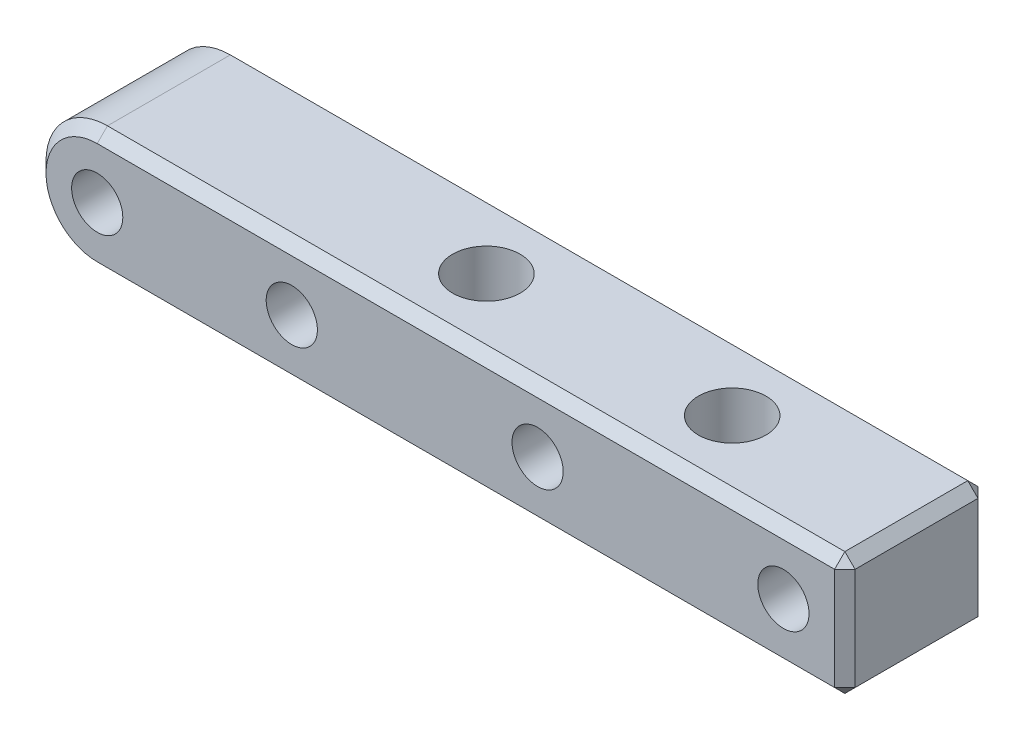
ISO-10303-21;
HEADER;
FILE_DESCRIPTION(('STEP AP214'),'2;1');
FILE_NAME('part.step','',(''),(''),'','','');
FILE_SCHEMA(('AUTOMOTIVE_DESIGN { 1 0 10303 214 1 1 1 1 }'));
ENDSEC;
DATA;
#1=APPLICATION_CONTEXT('core data for automotive mechanical design processes');
#2=APPLICATION_PROTOCOL_DEFINITION('international standard','automotive_design',2000,#1);
#3=PRODUCT_CONTEXT('',#1,'mechanical');
#4=PRODUCT('Part','Part','',(#3));
#5=PRODUCT_RELATED_PRODUCT_CATEGORY('part','',(#4));
#6=PRODUCT_DEFINITION_FORMATION('','',#4);
#7=PRODUCT_DEFINITION_CONTEXT('part definition',#1,'design');
#8=PRODUCT_DEFINITION('design','',#6,#7);
#9=PRODUCT_DEFINITION_SHAPE('','',#8);
#10=(LENGTH_UNIT() NAMED_UNIT(*) SI_UNIT(.MILLI.,.METRE.));
#11=(NAMED_UNIT(*) PLANE_ANGLE_UNIT() SI_UNIT($,.RADIAN.));
#12=(NAMED_UNIT(*) SI_UNIT($,.STERADIAN.) SOLID_ANGLE_UNIT());
#13=UNCERTAINTY_MEASURE_WITH_UNIT(LENGTH_MEASURE(1.E-05),#10,'distance_accuracy_value','');
#14=(GEOMETRIC_REPRESENTATION_CONTEXT(3) GLOBAL_UNCERTAINTY_ASSIGNED_CONTEXT((#13)) GLOBAL_UNIT_ASSIGNED_CONTEXT((#10,
#11,#12)) REPRESENTATION_CONTEXT('',''));
#15=CARTESIAN_POINT('',(0.,0.,0.));
#16=DIRECTION('',(0.,0.,1.));
#17=DIRECTION('',(1.,0.,0.));
#18=AXIS2_PLACEMENT_3D('',#15,#16,#17);
#19=CARTESIAN_POINT('',(-33.5,0.,3.5));
#20=DIRECTION('',(0.,0.,1.));
#21=DIRECTION('',(1.,0.,0.));
#22=AXIS2_PLACEMENT_3D('',#19,#20,#21);
#23=PLANE('',#22);
#24=CARTESIAN_POINT('',(-33.5,0.,3.5));
#25=DIRECTION('',(0.,0.,1.));
#26=DIRECTION('',(1.,0.,0.));
#27=AXIS2_PLACEMENT_3D('',#24,#25,#26);
#28=CIRCLE('',#27,2.5);
#29=CARTESIAN_POINT('',(-33.5,2.49999999999999,3.5));
#30=VERTEX_POINT('',#29);
#31=CARTESIAN_POINT('',(-33.5,-2.5,3.5));
#32=VERTEX_POINT('',#31);
#33=EDGE_CURVE('E210',#30,#32,#28,.T.);
#34=ORIENTED_EDGE('',*,*,#33,.T.);
#35=DIRECTION('',(1.,0.,0.));
#36=VECTOR('',#35,1.);
#37=CARTESIAN_POINT('',(3.,-2.5,3.5));
#38=LINE('',#37,#36);
#39=CARTESIAN_POINT('',(2.5,-2.5,3.5));
#40=VERTEX_POINT('',#39);
#41=EDGE_CURVE('E155',#32,#40,#38,.T.);
#42=ORIENTED_EDGE('',*,*,#41,.T.);
#43=DIRECTION('',(0.,1.,0.));
#44=VECTOR('',#43,1.);
#45=CARTESIAN_POINT('',(2.49999999999999,3.,3.5));
#46=LINE('',#45,#44);
#47=CARTESIAN_POINT('',(2.49999999999999,2.49999999999999,3.5));
#48=VERTEX_POINT('',#47);
#49=EDGE_CURVE('E212',#40,#48,#46,.T.);
#50=ORIENTED_EDGE('',*,*,#49,.T.);
#51=DIRECTION('',(-1.,0.,0.));
#52=VECTOR('',#51,1.);
#53=CARTESIAN_POINT('',(-33.5,2.49999999999999,3.5));
#54=LINE('',#53,#52);
#55=EDGE_CURVE('E214',#48,#30,#54,.T.);
#56=ORIENTED_EDGE('',*,*,#55,.T.);
#57=EDGE_LOOP('',(#34,#42,#50,#56));
#58=FACE_BOUND('',#57,.T.);
#59=CARTESIAN_POINT('',(0.,0.,3.5));
#60=DIRECTION('',(0.,0.,1.));
#61=DIRECTION('',(1.,0.,0.));
#62=AXIS2_PLACEMENT_3D('',#59,#60,#61);
#63=CIRCLE('',#62,1.25);
#64=CARTESIAN_POINT('',(1.25,0.,3.5));
#65=VERTEX_POINT('',#64);
#66=EDGE_CURVE('E248',#65,#65,#63,.T.);
#67=ORIENTED_EDGE('',*,*,#66,.F.);
#68=EDGE_LOOP('',(#67));
#69=FACE_BOUND('',#68,.T.);
#70=CARTESIAN_POINT('',(-12.,0.,3.5));
#71=DIRECTION('',(0.,0.,1.));
#72=DIRECTION('',(1.,0.,0.));
#73=AXIS2_PLACEMENT_3D('',#70,#71,#72);
#74=CIRCLE('',#73,1.25);
#75=CARTESIAN_POINT('',(-10.75,0.,3.5));
#76=VERTEX_POINT('',#75);
#77=EDGE_CURVE('E242',#76,#76,#74,.T.);
#78=ORIENTED_EDGE('',*,*,#77,.F.);
#79=EDGE_LOOP('',(#78));
#80=FACE_BOUND('',#79,.T.);
#81=CARTESIAN_POINT('',(-24.,0.,3.5));
#82=DIRECTION('',(0.,0.,1.));
#83=DIRECTION('',(1.,0.,0.));
#84=AXIS2_PLACEMENT_3D('',#81,#82,#83);
#85=CIRCLE('',#84,1.25);
#86=CARTESIAN_POINT('',(-22.75,0.,3.5));
#87=VERTEX_POINT('',#86);
#88=EDGE_CURVE('E236',#87,#87,#85,.T.);
#89=ORIENTED_EDGE('',*,*,#88,.F.);
#90=EDGE_LOOP('',(#89));
#91=FACE_BOUND('',#90,.T.);
#92=CARTESIAN_POINT('',(-33.5,0.,3.5));
#93=DIRECTION('',(0.,0.,1.));
#94=DIRECTION('',(1.,0.,0.));
#95=AXIS2_PLACEMENT_3D('',#92,#93,#94);
#96=CIRCLE('',#95,1.25);
#97=CARTESIAN_POINT('',(-32.25,0.,3.5));
#98=VERTEX_POINT('',#97);
#99=EDGE_CURVE('E230',#98,#98,#96,.T.);
#100=ORIENTED_EDGE('',*,*,#99,.F.);
#101=EDGE_LOOP('',(#100));
#102=FACE_BOUND('',#101,.T.);
#103=ADVANCED_FACE('F45',(#58,#69,#80,#91,#102),#23,.T.);
#104=CARTESIAN_POINT('',(-33.5,0.,-3.5));
#105=DIRECTION('',(0.,0.,1.));
#106=DIRECTION('',(1.,0.,0.));
#107=AXIS2_PLACEMENT_3D('',#104,#105,#106);
#108=PLANE('',#107);
#109=DIRECTION('',(0.,-1.,0.));
#110=VECTOR('',#109,1.);
#111=CARTESIAN_POINT('',(2.5,0.,-3.5));
#112=LINE('',#111,#110);
#113=CARTESIAN_POINT('',(2.49999999999999,2.49999999999999,-3.5));
#114=VERTEX_POINT('',#113);
#115=CARTESIAN_POINT('',(2.5,-2.5,-3.5));
#116=VERTEX_POINT('',#115);
#117=EDGE_CURVE('E221',#114,#116,#112,.T.);
#118=ORIENTED_EDGE('',*,*,#117,.T.);
#119=DIRECTION('',(-1.,0.,0.));
#120=VECTOR('',#119,1.);
#121=CARTESIAN_POINT('',(-33.5,-2.5,-3.5));
#122=LINE('',#121,#120);
#123=CARTESIAN_POINT('',(-33.5,-2.5,-3.5));
#124=VERTEX_POINT('',#123);
#125=EDGE_CURVE('E216',#116,#124,#122,.T.);
#126=ORIENTED_EDGE('',*,*,#125,.T.);
#127=CARTESIAN_POINT('',(-33.5,0.,-3.5));
#128=DIRECTION('',(0.,0.,1.));
#129=DIRECTION('',(1.,0.,0.));
#130=AXIS2_PLACEMENT_3D('',#127,#128,#129);
#131=CIRCLE('',#130,2.5);
#132=CARTESIAN_POINT('',(-33.5,2.49999999999999,-3.5));
#133=VERTEX_POINT('',#132);
#134=EDGE_CURVE('E219',#124,#133,#131,.F.);
#135=ORIENTED_EDGE('',*,*,#134,.T.);
#136=DIRECTION('',(1.,0.,0.));
#137=VECTOR('',#136,1.);
#138=CARTESIAN_POINT('',(-33.5,2.49999999999999,-3.5));
#139=LINE('',#138,#137);
#140=EDGE_CURVE('E223',#133,#114,#139,.T.);
#141=ORIENTED_EDGE('',*,*,#140,.T.);
#142=EDGE_LOOP('',(#118,#126,#135,#141));
#143=FACE_BOUND('',#142,.T.);
#144=CARTESIAN_POINT('',(0.,0.,-3.5));
#145=DIRECTION('',(0.,0.,1.));
#146=DIRECTION('',(1.,0.,0.));
#147=AXIS2_PLACEMENT_3D('',#144,#145,#146);
#148=CIRCLE('',#147,1.25);
#149=CARTESIAN_POINT('',(1.25,0.,-3.5));
#150=VERTEX_POINT('',#149);
#151=EDGE_CURVE('E245',#150,#150,#148,.T.);
#152=ORIENTED_EDGE('',*,*,#151,.T.);
#153=EDGE_LOOP('',(#152));
#154=FACE_BOUND('',#153,.T.);
#155=CARTESIAN_POINT('',(-12.,0.,-3.5));
#156=DIRECTION('',(0.,0.,1.));
#157=DIRECTION('',(1.,0.,0.));
#158=AXIS2_PLACEMENT_3D('',#155,#156,#157);
#159=CIRCLE('',#158,1.25);
#160=CARTESIAN_POINT('',(-10.75,0.,-3.5));
#161=VERTEX_POINT('',#160);
#162=EDGE_CURVE('E239',#161,#161,#159,.T.);
#163=ORIENTED_EDGE('',*,*,#162,.T.);
#164=EDGE_LOOP('',(#163));
#165=FACE_BOUND('',#164,.T.);
#166=CARTESIAN_POINT('',(-24.,0.,-3.5));
#167=DIRECTION('',(0.,0.,1.));
#168=DIRECTION('',(1.,0.,0.));
#169=AXIS2_PLACEMENT_3D('',#166,#167,#168);
#170=CIRCLE('',#169,1.25);
#171=CARTESIAN_POINT('',(-22.75,0.,-3.5));
#172=VERTEX_POINT('',#171);
#173=EDGE_CURVE('E233',#172,#172,#170,.T.);
#174=ORIENTED_EDGE('',*,*,#173,.T.);
#175=EDGE_LOOP('',(#174));
#176=FACE_BOUND('',#175,.T.);
#177=CARTESIAN_POINT('',(-33.5,0.,-3.5));
#178=DIRECTION('',(0.,0.,1.));
#179=DIRECTION('',(1.,0.,0.));
#180=AXIS2_PLACEMENT_3D('',#177,#178,#179);
#181=CIRCLE('',#180,1.25);
#182=CARTESIAN_POINT('',(-32.25,0.,-3.5));
#183=VERTEX_POINT('',#182);
#184=EDGE_CURVE('E145',#183,#183,#181,.T.);
#185=ORIENTED_EDGE('',*,*,#184,.T.);
#186=EDGE_LOOP('',(#185));
#187=FACE_BOUND('',#186,.T.);
#188=ADVANCED_FACE('F269',(#143,#154,#165,#176,#187),#108,.F.);
#189=CARTESIAN_POINT('',(-33.5,3.,3.5));
#190=DIRECTION('',(0.,-1.,0.));
#191=DIRECTION('',(1.,0.,0.));
#192=AXIS2_PLACEMENT_3D('',#189,#190,#191);
#193=PLANE('',#192);
#194=CARTESIAN_POINT('',(-6.,3.,0.));
#195=DIRECTION('',(0.,1.,0.));
#196=DIRECTION('',(0.,0.,1.));
#197=AXIS2_PLACEMENT_3D('',#194,#195,#196);
#198=CIRCLE('',#197,1.65);
#199=CARTESIAN_POINT('',(-6.,3.,1.65));
#200=VERTEX_POINT('',#199);
#201=EDGE_CURVE('E260',#200,#200,#198,.T.);
#202=ORIENTED_EDGE('',*,*,#201,.F.);
#203=EDGE_LOOP('',(#202));
#204=FACE_BOUND('',#203,.T.);
#205=CARTESIAN_POINT('',(-18.,3.,0.));
#206=DIRECTION('',(0.,1.,0.));
#207=DIRECTION('',(0.,0.,1.));
#208=AXIS2_PLACEMENT_3D('',#205,#206,#207);
#209=CIRCLE('',#208,1.65);
#210=CARTESIAN_POINT('',(-18.,3.,1.65));
#211=VERTEX_POINT('',#210);
#212=EDGE_CURVE('E254',#211,#211,#209,.T.);
#213=ORIENTED_EDGE('',*,*,#212,.F.);
#214=EDGE_LOOP('',(#213));
#215=FACE_BOUND('',#214,.T.);
#216=DIRECTION('',(0.,0.,-1.));
#217=VECTOR('',#216,1.);
#218=CARTESIAN_POINT('',(2.5,3.,3.5));
#219=LINE('',#218,#217);
#220=CARTESIAN_POINT('',(2.5,3.,3.));
#221=VERTEX_POINT('',#220);
#222=CARTESIAN_POINT('',(2.5,3.,-3.));
#223=VERTEX_POINT('',#222);
#224=EDGE_CURVE('E54',#221,#223,#219,.T.);
#225=ORIENTED_EDGE('',*,*,#224,.T.);
#226=DIRECTION('',(-1.,0.,0.));
#227=VECTOR('',#226,1.);
#228=CARTESIAN_POINT('',(-33.5,3.,-3.));
#229=LINE('',#228,#227);
#230=CARTESIAN_POINT('',(-33.5,3.,-3.));
#231=VERTEX_POINT('',#230);
#232=EDGE_CURVE('E11',#223,#231,#229,.T.);
#233=ORIENTED_EDGE('',*,*,#232,.T.);
#234=DIRECTION('',(0.,0.,-1.));
#235=VECTOR('',#234,1.);
#236=CARTESIAN_POINT('',(-33.5,3.,3.5));
#237=LINE('',#236,#235);
#238=CARTESIAN_POINT('',(-33.5,3.,3.));
#239=VERTEX_POINT('',#238);
#240=EDGE_CURVE('E144',#239,#231,#237,.T.);
#241=ORIENTED_EDGE('',*,*,#240,.F.);
#242=DIRECTION('',(1.,0.,0.));
#243=VECTOR('',#242,1.);
#244=CARTESIAN_POINT('',(3.,3.,3.));
#245=LINE('',#244,#243);
#246=EDGE_CURVE('E65',#239,#221,#245,.T.);
#247=ORIENTED_EDGE('',*,*,#246,.T.);
#248=EDGE_LOOP('',(#225,#233,#241,#247));
#249=FACE_BOUND('',#248,.T.);
#250=ADVANCED_FACE('F266',(#204,#215,#249),#193,.F.);
#251=CARTESIAN_POINT('',(-33.5,0.,3.5));
#252=DIRECTION('',(0.,0.,-1.));
#253=DIRECTION('',(-1.,0.,0.));
#254=AXIS2_PLACEMENT_3D('',#251,#252,#253);
#255=CYLINDRICAL_SURFACE('',#254,3.);
#256=ORIENTED_EDGE('',*,*,#240,.T.);
#257=CARTESIAN_POINT('',(-33.5,0.,-3.));
#258=DIRECTION('',(0.,0.,1.));
#259=DIRECTION('',(1.,0.,0.));
#260=AXIS2_PLACEMENT_3D('',#257,#258,#259);
#261=CIRCLE('',#260,3.);
#262=CARTESIAN_POINT('',(-33.5,-3.,-3.));
#263=VERTEX_POINT('',#262);
#264=EDGE_CURVE('E143',#231,#263,#261,.T.);
#265=ORIENTED_EDGE('',*,*,#264,.T.);
#266=DIRECTION('',(0.,0.,-1.));
#267=VECTOR('',#266,1.);
#268=CARTESIAN_POINT('',(-33.5,-3.,3.5));
#269=LINE('',#268,#267);
#270=CARTESIAN_POINT('',(-33.5,-3.,3.));
#271=VERTEX_POINT('',#270);
#272=EDGE_CURVE('E127',#271,#263,#269,.T.);
#273=ORIENTED_EDGE('',*,*,#272,.F.);
#274=CARTESIAN_POINT('',(-33.5,0.,3.));
#275=DIRECTION('',(0.,0.,1.));
#276=DIRECTION('',(1.,0.,0.));
#277=AXIS2_PLACEMENT_3D('',#274,#275,#276);
#278=CIRCLE('',#277,3.);
#279=EDGE_CURVE('E141',#271,#239,#278,.F.);
#280=ORIENTED_EDGE('',*,*,#279,.T.);
#281=EDGE_LOOP('',(#256,#265,#273,#280));
#282=FACE_BOUND('',#281,.T.);
#283=ADVANCED_FACE('F140',(#282),#255,.T.);
#284=CARTESIAN_POINT('',(3.,-3.,3.5));
#285=DIRECTION('',(0.,1.,0.));
#286=DIRECTION('',(-1.,0.,0.));
#287=AXIS2_PLACEMENT_3D('',#284,#285,#286);
#288=PLANE('',#287);
#289=ORIENTED_EDGE('',*,*,#272,.T.);
#290=DIRECTION('',(1.,0.,0.));
#291=VECTOR('',#290,1.);
#292=CARTESIAN_POINT('',(3.,-3.,-3.));
#293=LINE('',#292,#291);
#294=CARTESIAN_POINT('',(2.5,-3.,-3.));
#295=VERTEX_POINT('',#294);
#296=EDGE_CURVE('E135',#263,#295,#293,.T.);
#297=ORIENTED_EDGE('',*,*,#296,.T.);
#298=DIRECTION('',(0.,0.,1.));
#299=VECTOR('',#298,1.);
#300=CARTESIAN_POINT('',(2.5,-3.,3.5));
#301=LINE('',#300,#299);
#302=CARTESIAN_POINT('',(2.5,-3.,3.));
#303=VERTEX_POINT('',#302);
#304=EDGE_CURVE('E130',#295,#303,#301,.T.);
#305=ORIENTED_EDGE('',*,*,#304,.T.);
#306=DIRECTION('',(-1.,0.,0.));
#307=VECTOR('',#306,1.);
#308=CARTESIAN_POINT('',(-33.5,-3.,3.));
#309=LINE('',#308,#307);
#310=EDGE_CURVE('E122',#303,#271,#309,.T.);
#311=ORIENTED_EDGE('',*,*,#310,.T.);
#312=EDGE_LOOP('',(#289,#297,#305,#311));
#313=FACE_BOUND('',#312,.T.);
#314=CARTESIAN_POINT('',(-6.,-3.,0.));
#315=DIRECTION('',(0.,1.,0.));
#316=DIRECTION('',(0.,0.,1.));
#317=AXIS2_PLACEMENT_3D('',#314,#315,#316);
#318=CIRCLE('',#317,1.65);
#319=CARTESIAN_POINT('',(-6.,-3.,1.65));
#320=VERTEX_POINT('',#319);
#321=EDGE_CURVE('E257',#320,#320,#318,.T.);
#322=ORIENTED_EDGE('',*,*,#321,.T.);
#323=EDGE_LOOP('',(#322));
#324=FACE_BOUND('',#323,.T.);
#325=CARTESIAN_POINT('',(-18.,-3.,0.));
#326=DIRECTION('',(0.,1.,0.));
#327=DIRECTION('',(0.,0.,1.));
#328=AXIS2_PLACEMENT_3D('',#325,#326,#327);
#329=CIRCLE('',#328,1.65);
#330=CARTESIAN_POINT('',(-18.,-3.,1.65));
#331=VERTEX_POINT('',#330);
#332=EDGE_CURVE('E251',#331,#331,#329,.T.);
#333=ORIENTED_EDGE('',*,*,#332,.T.);
#334=EDGE_LOOP('',(#333));
#335=FACE_BOUND('',#334,.T.);
#336=ADVANCED_FACE('F124',(#313,#324,#335),#288,.F.);
#337=CARTESIAN_POINT('',(3.,3.,3.5));
#338=DIRECTION('',(-1.,0.,0.));
#339=DIRECTION('',(0.,-1.,0.));
#340=AXIS2_PLACEMENT_3D('',#337,#338,#339);
#341=PLANE('',#340);
#342=DIRECTION('',(0.,-1.,0.));
#343=VECTOR('',#342,1.);
#344=CARTESIAN_POINT('',(3.,-3.,3.));
#345=LINE('',#344,#343);
#346=CARTESIAN_POINT('',(3.,2.49999999999999,3.));
#347=VERTEX_POINT('',#346);
#348=CARTESIAN_POINT('',(3.,-2.5,3.));
#349=VERTEX_POINT('',#348);
#350=EDGE_CURVE('E202',#347,#349,#345,.T.);
#351=ORIENTED_EDGE('',*,*,#350,.T.);
#352=DIRECTION('',(0.,0.,-1.));
#353=VECTOR('',#352,1.);
#354=CARTESIAN_POINT('',(3.,-2.5,3.5));
#355=LINE('',#354,#353);
#356=CARTESIAN_POINT('',(3.,-2.5,-3.));
#357=VERTEX_POINT('',#356);
#358=EDGE_CURVE('E199',#349,#357,#355,.T.);
#359=ORIENTED_EDGE('',*,*,#358,.T.);
#360=DIRECTION('',(0.,1.,0.));
#361=VECTOR('',#360,1.);
#362=CARTESIAN_POINT('',(3.,3.,-3.));
#363=LINE('',#362,#361);
#364=CARTESIAN_POINT('',(3.,2.49999999999999,-3.));
#365=VERTEX_POINT('',#364);
#366=EDGE_CURVE('E204',#357,#365,#363,.T.);
#367=ORIENTED_EDGE('',*,*,#366,.T.);
#368=DIRECTION('',(0.,0.,1.));
#369=VECTOR('',#368,1.);
#370=CARTESIAN_POINT('',(3.,2.49999999999999,3.5));
#371=LINE('',#370,#369);
#372=EDGE_CURVE('E206',#365,#347,#371,.T.);
#373=ORIENTED_EDGE('',*,*,#372,.T.);
#374=EDGE_LOOP('',(#351,#359,#367,#373));
#375=FACE_BOUND('',#374,.T.);
#376=ADVANCED_FACE('F302',(#375),#341,.F.);
#377=CARTESIAN_POINT('',(-33.5,0.,3.5));
#378=DIRECTION('',(0.,0.,1.));
#379=DIRECTION('',(1.,0.,0.));
#380=AXIS2_PLACEMENT_3D('',#377,#378,#379);
#381=CYLINDRICAL_SURFACE('',#380,1.25);
#382=ORIENTED_EDGE('',*,*,#184,.F.);
#383=EDGE_LOOP('',(#382));
#384=FACE_BOUND('',#383,.T.);
#385=ORIENTED_EDGE('',*,*,#99,.T.);
#386=EDGE_LOOP('',(#385));
#387=FACE_BOUND('',#386,.T.);
#388=ADVANCED_FACE('F299',(#384,#387),#381,.F.);
#389=CARTESIAN_POINT('',(-24.,0.,3.5));
#390=DIRECTION('',(0.,0.,1.));
#391=DIRECTION('',(1.,0.,0.));
#392=AXIS2_PLACEMENT_3D('',#389,#390,#391);
#393=CYLINDRICAL_SURFACE('',#392,1.25);
#394=ORIENTED_EDGE('',*,*,#173,.F.);
#395=EDGE_LOOP('',(#394));
#396=FACE_BOUND('',#395,.T.);
#397=ORIENTED_EDGE('',*,*,#88,.T.);
#398=EDGE_LOOP('',(#397));
#399=FACE_BOUND('',#398,.T.);
#400=ADVANCED_FACE('F395',(#396,#399),#393,.F.);
#401=CARTESIAN_POINT('',(-12.,0.,3.5));
#402=DIRECTION('',(0.,0.,1.));
#403=DIRECTION('',(1.,0.,0.));
#404=AXIS2_PLACEMENT_3D('',#401,#402,#403);
#405=CYLINDRICAL_SURFACE('',#404,1.25);
#406=ORIENTED_EDGE('',*,*,#162,.F.);
#407=EDGE_LOOP('',(#406));
#408=FACE_BOUND('',#407,.T.);
#409=ORIENTED_EDGE('',*,*,#77,.T.);
#410=EDGE_LOOP('',(#409));
#411=FACE_BOUND('',#410,.T.);
#412=ADVANCED_FACE('F284',(#408,#411),#405,.F.);
#413=CARTESIAN_POINT('',(0.,0.,3.5));
#414=DIRECTION('',(0.,0.,1.));
#415=DIRECTION('',(1.,0.,0.));
#416=AXIS2_PLACEMENT_3D('',#413,#414,#415);
#417=CYLINDRICAL_SURFACE('',#416,1.25);
#418=ORIENTED_EDGE('',*,*,#151,.F.);
#419=EDGE_LOOP('',(#418));
#420=FACE_BOUND('',#419,.T.);
#421=ORIENTED_EDGE('',*,*,#66,.T.);
#422=EDGE_LOOP('',(#421));
#423=FACE_BOUND('',#422,.T.);
#424=ADVANCED_FACE('F275',(#420,#423),#417,.F.);
#425=CARTESIAN_POINT('',(-18.,3.,0.));
#426=DIRECTION('',(0.,1.,0.));
#427=DIRECTION('',(0.,0.,1.));
#428=AXIS2_PLACEMENT_3D('',#425,#426,#427);
#429=CYLINDRICAL_SURFACE('',#428,1.65);
#430=ORIENTED_EDGE('',*,*,#332,.F.);
#431=EDGE_LOOP('',(#430));
#432=FACE_BOUND('',#431,.T.);
#433=ORIENTED_EDGE('',*,*,#212,.T.);
#434=EDGE_LOOP('',(#433));
#435=FACE_BOUND('',#434,.T.);
#436=ADVANCED_FACE('F273',(#432,#435),#429,.F.);
#437=CARTESIAN_POINT('',(-6.,3.,0.));
#438=DIRECTION('',(0.,1.,0.));
#439=DIRECTION('',(0.,0.,1.));
#440=AXIS2_PLACEMENT_3D('',#437,#438,#439);
#441=CYLINDRICAL_SURFACE('',#440,1.65);
#442=ORIENTED_EDGE('',*,*,#321,.F.);
#443=EDGE_LOOP('',(#442));
#444=FACE_BOUND('',#443,.T.);
#445=ORIENTED_EDGE('',*,*,#201,.T.);
#446=EDGE_LOOP('',(#445));
#447=FACE_BOUND('',#446,.T.);
#448=ADVANCED_FACE('F264',(#444,#447),#441,.F.);
#449=CARTESIAN_POINT('',(-33.5,2.49999999999999,3.5));
#450=DIRECTION('',(0.,0.707106781186547,0.707106781186547));
#451=DIRECTION('',(1.,0.,0.));
#452=AXIS2_PLACEMENT_3D('',#449,#450,#451);
#453=PLANE('',#452);
#454=DIRECTION('',(0.,-0.707106781186548,0.707106781186548));
#455=VECTOR('',#454,1.);
#456=CARTESIAN_POINT('',(2.49999999999999,2.49999999999999,3.5));
#457=LINE('',#456,#455);
#458=EDGE_CURVE('E159',#221,#48,#457,.T.);
#459=ORIENTED_EDGE('',*,*,#458,.F.);
#460=ORIENTED_EDGE('',*,*,#246,.F.);
#461=DIRECTION('',(0.,0.707106781186547,-0.707106781186547));
#462=VECTOR('',#461,1.);
#463=CARTESIAN_POINT('',(-33.5,2.49999999999999,3.5));
#464=LINE('',#463,#462);
#465=EDGE_CURVE('E49',#30,#239,#464,.T.);
#466=ORIENTED_EDGE('',*,*,#465,.F.);
#467=ORIENTED_EDGE('',*,*,#55,.F.);
#468=EDGE_LOOP('',(#459,#460,#466,#467));
#469=FACE_BOUND('',#468,.T.);
#470=ADVANCED_FACE('F47',(#469),#453,.T.);
#471=CARTESIAN_POINT('',(-33.5,0.,3.5));
#472=DIRECTION('',(0.,0.,-1.));
#473=DIRECTION('',(-1.,0.,0.));
#474=AXIS2_PLACEMENT_3D('',#471,#472,#473);
#475=CONICAL_SURFACE('',#474,2.5,0.785398163397448);
#476=ORIENTED_EDGE('',*,*,#465,.T.);
#477=ORIENTED_EDGE('',*,*,#279,.F.);
#478=DIRECTION('',(0.,-0.707106781186547,-0.707106781186547));
#479=VECTOR('',#478,1.);
#480=CARTESIAN_POINT('',(-33.5,-2.5,3.5));
#481=LINE('',#480,#479);
#482=EDGE_CURVE('E152',#32,#271,#481,.T.);
#483=ORIENTED_EDGE('',*,*,#482,.F.);
#484=ORIENTED_EDGE('',*,*,#33,.F.);
#485=EDGE_LOOP('',(#476,#477,#483,#484));
#486=FACE_BOUND('',#485,.T.);
#487=ADVANCED_FACE('F150',(#486),#475,.T.);
#488=CARTESIAN_POINT('',(2.49999999999999,2.49999999999999,3.5));
#489=DIRECTION('',(0.577350269189625,0.577350269189626,0.577350269189626));
#490=DIRECTION('',(0.,-0.707106781186548,0.707106781186547));
#491=AXIS2_PLACEMENT_3D('',#488,#489,#490);
#492=PLANE('',#491);
#493=DIRECTION('',(0.707106781186548,-0.707106781186547,0.));
#494=VECTOR('',#493,1.);
#495=CARTESIAN_POINT('',(2.75,2.75,3.));
#496=LINE('',#495,#494);
#497=EDGE_CURVE('E164',#221,#347,#496,.T.);
#498=ORIENTED_EDGE('',*,*,#497,.F.);
#499=ORIENTED_EDGE('',*,*,#458,.T.);
#500=DIRECTION('',(0.707106781186548,0.,-0.707106781186547));
#501=VECTOR('',#500,1.);
#502=CARTESIAN_POINT('',(2.49999999999999,2.49999999999999,3.5));
#503=LINE('',#502,#501);
#504=EDGE_CURVE('E160',#347,#48,#503,.F.);
#505=ORIENTED_EDGE('',*,*,#504,.F.);
#506=EDGE_LOOP('',(#498,#499,#505));
#507=FACE_BOUND('',#506,.T.);
#508=ADVANCED_FACE('F352',(#507),#492,.T.);
#509=CARTESIAN_POINT('',(-33.5,-2.5,3.5));
#510=DIRECTION('',(0.,-0.707106781186547,0.707106781186547));
#511=DIRECTION('',(-1.,0.,0.));
#512=AXIS2_PLACEMENT_3D('',#509,#510,#511);
#513=PLANE('',#512);
#514=ORIENTED_EDGE('',*,*,#482,.T.);
#515=ORIENTED_EDGE('',*,*,#310,.F.);
#516=DIRECTION('',(0.,-0.707106781186548,-0.707106781186548));
#517=VECTOR('',#516,1.);
#518=CARTESIAN_POINT('',(2.5,-2.5,3.5));
#519=LINE('',#518,#517);
#520=EDGE_CURVE('E169',#40,#303,#519,.T.);
#521=ORIENTED_EDGE('',*,*,#520,.F.);
#522=ORIENTED_EDGE('',*,*,#41,.F.);
#523=EDGE_LOOP('',(#514,#515,#521,#522));
#524=FACE_BOUND('',#523,.T.);
#525=ADVANCED_FACE('F157',(#524),#513,.T.);
#526=CARTESIAN_POINT('',(2.5,0.,3.5));
#527=DIRECTION('',(0.707106781186547,0.,0.707106781186548));
#528=DIRECTION('',(0.,-1.,0.));
#529=AXIS2_PLACEMENT_3D('',#526,#527,#528);
#530=PLANE('',#529);
#531=ORIENTED_EDGE('',*,*,#504,.T.);
#532=ORIENTED_EDGE('',*,*,#49,.F.);
#533=DIRECTION('',(-0.707106781186548,0.,0.707106781186547));
#534=VECTOR('',#533,1.);
#535=CARTESIAN_POINT('',(2.5,-2.5,3.5));
#536=LINE('',#535,#534);
#537=EDGE_CURVE('E171',#349,#40,#536,.T.);
#538=ORIENTED_EDGE('',*,*,#537,.F.);
#539=ORIENTED_EDGE('',*,*,#350,.F.);
#540=EDGE_LOOP('',(#531,#532,#538,#539));
#541=FACE_BOUND('',#540,.T.);
#542=ADVANCED_FACE('F345',(#541),#530,.T.);
#543=CARTESIAN_POINT('',(2.5,3.,3.5));
#544=DIRECTION('',(-0.707106781186547,-0.707106781186548,0.));
#545=DIRECTION('',(0.,0.,-1.));
#546=AXIS2_PLACEMENT_3D('',#543,#544,#545);
#547=PLANE('',#546);
#548=ORIENTED_EDGE('',*,*,#497,.T.);
#549=ORIENTED_EDGE('',*,*,#372,.F.);
#550=DIRECTION('',(-0.707106781186548,0.707106781186547,0.));
#551=VECTOR('',#550,1.);
#552=CARTESIAN_POINT('',(3.,2.49999999999999,-3.));
#553=LINE('',#552,#551);
#554=EDGE_CURVE('E173',#223,#365,#553,.F.);
#555=ORIENTED_EDGE('',*,*,#554,.F.);
#556=ORIENTED_EDGE('',*,*,#224,.F.);
#557=EDGE_LOOP('',(#548,#549,#555,#556));
#558=FACE_BOUND('',#557,.T.);
#559=ADVANCED_FACE('F341',(#558),#547,.F.);
#560=CARTESIAN_POINT('',(2.5,-2.5,3.5));
#561=DIRECTION('',(0.577350269189625,-0.577350269189626,0.577350269189627));
#562=DIRECTION('',(0.,-0.707106781186548,-0.707106781186547));
#563=AXIS2_PLACEMENT_3D('',#560,#561,#562);
#564=PLANE('',#563);
#565=ORIENTED_EDGE('',*,*,#537,.T.);
#566=ORIENTED_EDGE('',*,*,#520,.T.);
#567=DIRECTION('',(-0.707106781186548,-0.707106781186547,0.));
#568=VECTOR('',#567,1.);
#569=CARTESIAN_POINT('',(2.75,-2.75,3.));
#570=LINE('',#569,#568);
#571=EDGE_CURVE('E179',#349,#303,#570,.T.);
#572=ORIENTED_EDGE('',*,*,#571,.F.);
#573=EDGE_LOOP('',(#565,#566,#572));
#574=FACE_BOUND('',#573,.T.);
#575=ADVANCED_FACE('F337',(#574),#564,.T.);
#576=CARTESIAN_POINT('',(3.,2.49999999999999,-3.));
#577=DIRECTION('',(0.577350269189625,0.577350269189626,-0.577350269189626));
#578=DIRECTION('',(0.,0.707106781186548,0.707106781186547));
#579=AXIS2_PLACEMENT_3D('',#576,#577,#578);
#580=PLANE('',#579);
#581=DIRECTION('',(0.707106781186548,0.,0.707106781186547));
#582=VECTOR('',#581,1.);
#583=CARTESIAN_POINT('',(3.,2.49999999999999,-3.));
#584=LINE('',#583,#582);
#585=EDGE_CURVE('E182',#114,#365,#584,.T.);
#586=ORIENTED_EDGE('',*,*,#585,.F.);
#587=DIRECTION('',(0.,-0.707106781186548,-0.707106781186548));
#588=VECTOR('',#587,1.);
#589=CARTESIAN_POINT('',(2.5,2.75,-3.25));
#590=LINE('',#589,#588);
#591=EDGE_CURVE('E176',#223,#114,#590,.T.);
#592=ORIENTED_EDGE('',*,*,#591,.F.);
#593=ORIENTED_EDGE('',*,*,#554,.T.);
#594=EDGE_LOOP('',(#586,#592,#593));
#595=FACE_BOUND('',#594,.T.);
#596=ADVANCED_FACE('F333',(#595),#580,.T.);
#597=CARTESIAN_POINT('',(-33.5,3.,-3.));
#598=DIRECTION('',(0.,-0.707106781186547,0.707106781186547));
#599=DIRECTION('',(-1.,0.,0.));
#600=AXIS2_PLACEMENT_3D('',#597,#598,#599);
#601=PLANE('',#600);
#602=ORIENTED_EDGE('',*,*,#591,.T.);
#603=ORIENTED_EDGE('',*,*,#140,.F.);
#604=DIRECTION('',(0.,-0.707106781186547,-0.707106781186547));
#605=VECTOR('',#604,1.);
#606=CARTESIAN_POINT('',(-33.5,3.,-3.));
#607=LINE('',#606,#605);
#608=EDGE_CURVE('E185',#231,#133,#607,.T.);
#609=ORIENTED_EDGE('',*,*,#608,.F.);
#610=ORIENTED_EDGE('',*,*,#232,.F.);
#611=EDGE_LOOP('',(#602,#603,#609,#610));
#612=FACE_BOUND('',#611,.T.);
#613=ADVANCED_FACE('F329',(#612),#601,.F.);
#614=CARTESIAN_POINT('',(3.,-2.5,3.5));
#615=DIRECTION('',(-0.707106781186547,0.707106781186548,0.));
#616=DIRECTION('',(0.,0.,-1.));
#617=AXIS2_PLACEMENT_3D('',#614,#615,#616);
#618=PLANE('',#617);
#619=ORIENTED_EDGE('',*,*,#571,.T.);
#620=ORIENTED_EDGE('',*,*,#304,.F.);
#621=DIRECTION('',(0.707106781186548,0.707106781186547,0.));
#622=VECTOR('',#621,1.);
#623=CARTESIAN_POINT('',(2.5,-3.,-3.));
#624=LINE('',#623,#622);
#625=EDGE_CURVE('E188',#357,#295,#624,.F.);
#626=ORIENTED_EDGE('',*,*,#625,.F.);
#627=ORIENTED_EDGE('',*,*,#358,.F.);
#628=EDGE_LOOP('',(#619,#620,#626,#627));
#629=FACE_BOUND('',#628,.T.);
#630=ADVANCED_FACE('F325',(#629),#618,.F.);
#631=CARTESIAN_POINT('',(3.,3.,-3.));
#632=DIRECTION('',(-0.707106781186547,0.,0.707106781186548));
#633=DIRECTION('',(0.,1.,0.));
#634=AXIS2_PLACEMENT_3D('',#631,#632,#633);
#635=PLANE('',#634);
#636=ORIENTED_EDGE('',*,*,#585,.T.);
#637=ORIENTED_EDGE('',*,*,#366,.F.);
#638=DIRECTION('',(-0.707106781186548,0.,-0.707106781186547));
#639=VECTOR('',#638,1.);
#640=CARTESIAN_POINT('',(2.75,-2.5,-3.25));
#641=LINE('',#640,#639);
#642=EDGE_CURVE('E191',#116,#357,#641,.F.);
#643=ORIENTED_EDGE('',*,*,#642,.F.);
#644=ORIENTED_EDGE('',*,*,#117,.F.);
#645=EDGE_LOOP('',(#636,#637,#643,#644));
#646=FACE_BOUND('',#645,.T.);
#647=ADVANCED_FACE('F321',(#646),#635,.F.);
#648=CARTESIAN_POINT('',(-33.5,0.,-3.));
#649=DIRECTION('',(0.,0.,1.));
#650=DIRECTION('',(1.,0.,0.));
#651=AXIS2_PLACEMENT_3D('',#648,#649,#650);
#652=CONICAL_SURFACE('',#651,3.,0.785398163397448);
#653=ORIENTED_EDGE('',*,*,#608,.T.);
#654=ORIENTED_EDGE('',*,*,#134,.F.);
#655=DIRECTION('',(0.,0.707106781186547,-0.707106781186547));
#656=VECTOR('',#655,1.);
#657=CARTESIAN_POINT('',(-33.5,-3.,-3.));
#658=LINE('',#657,#656);
#659=EDGE_CURVE('E193',#263,#124,#658,.T.);
#660=ORIENTED_EDGE('',*,*,#659,.F.);
#661=ORIENTED_EDGE('',*,*,#264,.F.);
#662=EDGE_LOOP('',(#653,#654,#660,#661));
#663=FACE_BOUND('',#662,.T.);
#664=ADVANCED_FACE('F317',(#663),#652,.T.);
#665=CARTESIAN_POINT('',(2.5,-3.,-3.));
#666=DIRECTION('',(0.577350269189625,-0.577350269189626,-0.577350269189627));
#667=DIRECTION('',(0.,0.707106781186548,-0.707106781186547));
#668=AXIS2_PLACEMENT_3D('',#665,#666,#667);
#669=PLANE('',#668);
#670=ORIENTED_EDGE('',*,*,#642,.T.);
#671=ORIENTED_EDGE('',*,*,#625,.T.);
#672=DIRECTION('',(0.,-0.707106781186548,0.707106781186548));
#673=VECTOR('',#672,1.);
#674=CARTESIAN_POINT('',(2.5,-3.,-3.));
#675=LINE('',#674,#673);
#676=EDGE_CURVE('E195',#116,#295,#675,.T.);
#677=ORIENTED_EDGE('',*,*,#676,.F.);
#678=EDGE_LOOP('',(#670,#671,#677));
#679=FACE_BOUND('',#678,.T.);
#680=ADVANCED_FACE('F313',(#679),#669,.T.);
#681=CARTESIAN_POINT('',(3.,-3.,-3.));
#682=DIRECTION('',(0.,0.707106781186547,0.707106781186547));
#683=DIRECTION('',(1.,0.,0.));
#684=AXIS2_PLACEMENT_3D('',#681,#682,#683);
#685=PLANE('',#684);
#686=ORIENTED_EDGE('',*,*,#659,.T.);
#687=ORIENTED_EDGE('',*,*,#125,.F.);
#688=ORIENTED_EDGE('',*,*,#676,.T.);
#689=ORIENTED_EDGE('',*,*,#296,.F.);
#690=EDGE_LOOP('',(#686,#687,#688,#689));
#691=FACE_BOUND('',#690,.T.);
#692=ADVANCED_FACE('F310',(#691),#685,.F.);
#693=CLOSED_SHELL('',(#103,#188,#250,#283,#336,#376,#388,#400,#412,#424,#436,#448,#470,#487,
#508,#525,#542,#559,#575,#596,#613,#630,#647,#664,#680,#692));
#694=MANIFOLD_SOLID_BREP('B2',#693);
#695=ADVANCED_BREP_SHAPE_REPRESENTATION('',(#18,#694),#14);
#696=SHAPE_DEFINITION_REPRESENTATION(#9,#695);
ENDSEC;
END-ISO-10303-21;
